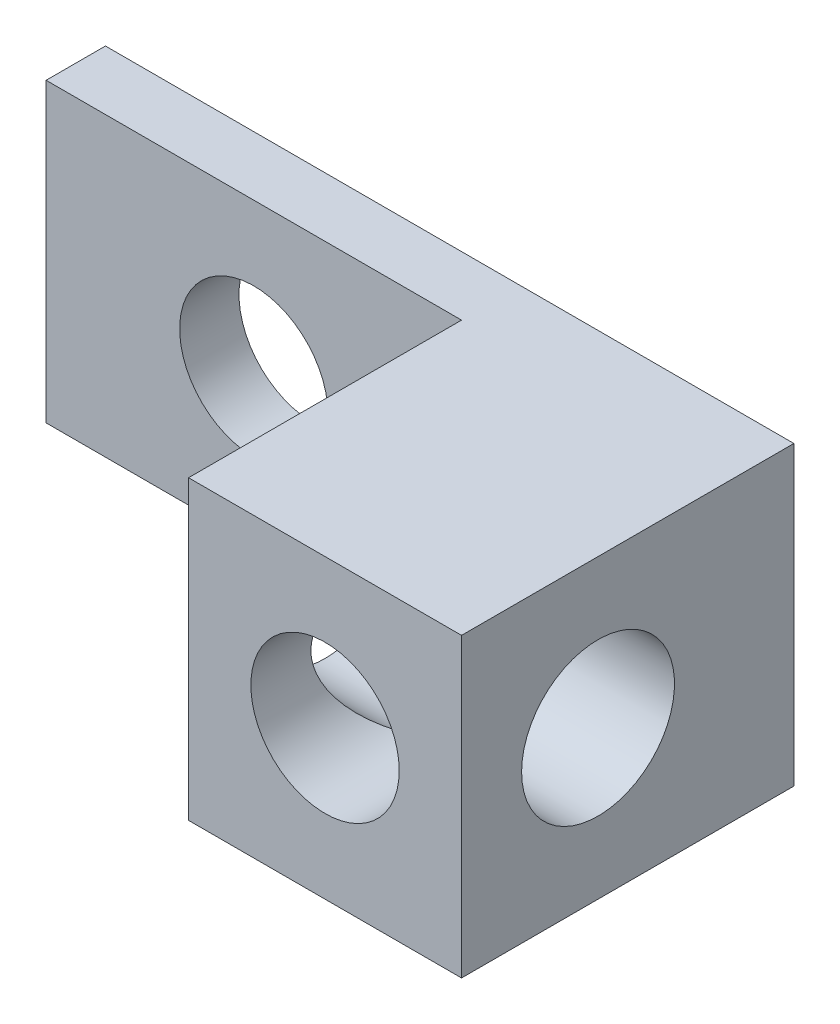
ISO-10303-21;
HEADER;
FILE_DESCRIPTION(('STEP AP214'),'2;1');
FILE_NAME('part.step','',(''),(''),'','','');
FILE_SCHEMA(('AUTOMOTIVE_DESIGN { 1 0 10303 214 1 1 1 1 }'));
ENDSEC;
DATA;
#1=APPLICATION_CONTEXT('core data for automotive mechanical design processes');
#2=APPLICATION_PROTOCOL_DEFINITION('international standard','automotive_design',2000,#1);
#3=PRODUCT_CONTEXT('',#1,'mechanical');
#4=PRODUCT('Part','Part','',(#3));
#5=PRODUCT_RELATED_PRODUCT_CATEGORY('part','',(#4));
#6=PRODUCT_DEFINITION_FORMATION('','',#4);
#7=PRODUCT_DEFINITION_CONTEXT('part definition',#1,'design');
#8=PRODUCT_DEFINITION('design','',#6,#7);
#9=PRODUCT_DEFINITION_SHAPE('','',#8);
#10=(LENGTH_UNIT() NAMED_UNIT(*) SI_UNIT(.MILLI.,.METRE.));
#11=(NAMED_UNIT(*) PLANE_ANGLE_UNIT() SI_UNIT($,.RADIAN.));
#12=(NAMED_UNIT(*) SI_UNIT($,.STERADIAN.) SOLID_ANGLE_UNIT());
#13=UNCERTAINTY_MEASURE_WITH_UNIT(LENGTH_MEASURE(1.E-05),#10,'distance_accuracy_value','');
#14=(GEOMETRIC_REPRESENTATION_CONTEXT(3) GLOBAL_UNCERTAINTY_ASSIGNED_CONTEXT((#13)) GLOBAL_UNIT_ASSIGNED_CONTEXT((#10,
#11,#12)) REPRESENTATION_CONTEXT('',''));
#15=CARTESIAN_POINT('',(0.,0.,0.));
#16=DIRECTION('',(0.,0.,1.));
#17=DIRECTION('',(1.,0.,0.));
#18=AXIS2_PLACEMENT_3D('',#15,#16,#17);
#19=CARTESIAN_POINT('',(-29.4639999999999,12.7,0.));
#20=DIRECTION('',(0.,0.,1.));
#21=DIRECTION('',(1.,0.,0.));
#22=AXIS2_PLACEMENT_3D('',#19,#20,#21);
#23=PLANE('',#22);
#24=CARTESIAN_POINT('',(-20.5740000000001,6.34999999999997,0.));
#25=DIRECTION('',(0.,0.,1.));
#26=DIRECTION('',(1.,0.,0.));
#27=AXIS2_PLACEMENT_3D('',#24,#25,#26);
#28=CIRCLE('',#27,3.175);
#29=CARTESIAN_POINT('',(-17.3990000000001,6.34999999999997,0.));
#30=VERTEX_POINT('',#29);
#31=EDGE_CURVE('E162',#30,#30,#28,.T.);
#32=ORIENTED_EDGE('',*,*,#31,.T.);
#33=EDGE_LOOP('',(#32));
#34=FACE_BOUND('',#33,.T.);
#35=DIRECTION('',(-1.,0.,0.));
#36=VECTOR('',#35,1.);
#37=CARTESIAN_POINT('',(-29.4639999999999,0.,0.));
#38=LINE('',#37,#36);
#39=CARTESIAN_POINT('',(0.,0.,0.));
#40=VERTEX_POINT('',#39);
#41=CARTESIAN_POINT('',(-29.4639999999999,0.,0.));
#42=VERTEX_POINT('',#41);
#43=EDGE_CURVE('E117',#40,#42,#38,.T.);
#44=ORIENTED_EDGE('',*,*,#43,.T.);
#45=DIRECTION('',(0.,-1.,0.));
#46=VECTOR('',#45,1.);
#47=CARTESIAN_POINT('',(-29.4639999999999,12.7,0.));
#48=LINE('',#47,#46);
#49=CARTESIAN_POINT('',(-29.4639999999999,12.7,0.));
#50=VERTEX_POINT('',#49);
#51=EDGE_CURVE('E11',#50,#42,#48,.T.);
#52=ORIENTED_EDGE('',*,*,#51,.F.);
#53=DIRECTION('',(-1.,0.,0.));
#54=VECTOR('',#53,1.);
#55=CARTESIAN_POINT('',(-29.4639999999999,12.7,0.));
#56=LINE('',#55,#54);
#57=CARTESIAN_POINT('',(0.,12.7,0.));
#58=VERTEX_POINT('',#57);
#59=EDGE_CURVE('E128',#58,#50,#56,.T.);
#60=ORIENTED_EDGE('',*,*,#59,.F.);
#61=DIRECTION('',(0.,-1.,0.));
#62=VECTOR('',#61,1.);
#63=CARTESIAN_POINT('',(0.,12.7,0.));
#64=LINE('',#63,#62);
#65=EDGE_CURVE('E113',#58,#40,#64,.T.);
#66=ORIENTED_EDGE('',*,*,#65,.T.);
#67=EDGE_LOOP('',(#44,#52,#60,#66));
#68=FACE_BOUND('',#67,.T.);
#69=ADVANCED_FACE('F33',(#34,#68),#23,.F.);
#70=CARTESIAN_POINT('',(-29.4639999999999,12.7,2.54));
#71=DIRECTION('',(1.,0.,0.));
#72=DIRECTION('',(0.,0.,-1.));
#73=AXIS2_PLACEMENT_3D('',#70,#71,#72);
#74=PLANE('',#73);
#75=DIRECTION('',(0.,0.,1.));
#76=VECTOR('',#75,1.);
#77=CARTESIAN_POINT('',(-29.4639999999999,0.,2.54));
#78=LINE('',#77,#76);
#79=CARTESIAN_POINT('',(-29.4639999999999,0.,2.54));
#80=VERTEX_POINT('',#79);
#81=EDGE_CURVE('E120',#42,#80,#78,.T.);
#82=ORIENTED_EDGE('',*,*,#81,.T.);
#83=DIRECTION('',(0.,-1.,0.));
#84=VECTOR('',#83,1.);
#85=CARTESIAN_POINT('',(-29.4639999999999,12.7,2.54));
#86=LINE('',#85,#84);
#87=CARTESIAN_POINT('',(-29.4639999999999,12.7,2.54));
#88=VERTEX_POINT('',#87);
#89=EDGE_CURVE('E41',#88,#80,#86,.T.);
#90=ORIENTED_EDGE('',*,*,#89,.F.);
#91=DIRECTION('',(0.,0.,1.));
#92=VECTOR('',#91,1.);
#93=CARTESIAN_POINT('',(-29.4639999999999,12.7,2.54));
#94=LINE('',#93,#92);
#95=EDGE_CURVE('E86',#50,#88,#94,.T.);
#96=ORIENTED_EDGE('',*,*,#95,.F.);
#97=ORIENTED_EDGE('',*,*,#51,.T.);
#98=EDGE_LOOP('',(#82,#90,#96,#97));
#99=FACE_BOUND('',#98,.T.);
#100=ADVANCED_FACE('F155',(#99),#74,.F.);
#101=CARTESIAN_POINT('',(-11.684,12.7,2.54));
#102=DIRECTION('',(0.,0.,-1.));
#103=DIRECTION('',(-1.,0.,0.));
#104=AXIS2_PLACEMENT_3D('',#101,#102,#103);
#105=PLANE('',#104);
#106=CARTESIAN_POINT('',(-20.5740000000001,6.34999999999997,2.54));
#107=DIRECTION('',(0.,0.,1.));
#108=DIRECTION('',(1.,0.,0.));
#109=AXIS2_PLACEMENT_3D('',#106,#107,#108);
#110=CIRCLE('',#109,3.175);
#111=CARTESIAN_POINT('',(-17.3990000000001,6.34999999999997,2.54));
#112=VERTEX_POINT('',#111);
#113=EDGE_CURVE('E165',#112,#112,#110,.T.);
#114=ORIENTED_EDGE('',*,*,#113,.F.);
#115=EDGE_LOOP('',(#114));
#116=FACE_BOUND('',#115,.T.);
#117=DIRECTION('',(1.,0.,0.));
#118=VECTOR('',#117,1.);
#119=CARTESIAN_POINT('',(-11.684,0.,2.54));
#120=LINE('',#119,#118);
#121=CARTESIAN_POINT('',(-11.684,0.,2.54));
#122=VERTEX_POINT('',#121);
#123=EDGE_CURVE('E123',#80,#122,#120,.T.);
#124=ORIENTED_EDGE('',*,*,#123,.T.);
#125=DIRECTION('',(0.,-1.,0.));
#126=VECTOR('',#125,1.);
#127=CARTESIAN_POINT('',(-11.684,12.7,2.54));
#128=LINE('',#127,#126);
#129=CARTESIAN_POINT('',(-11.684,12.7,2.54));
#130=VERTEX_POINT('',#129);
#131=EDGE_CURVE('E108',#130,#122,#128,.T.);
#132=ORIENTED_EDGE('',*,*,#131,.F.);
#133=DIRECTION('',(1.,0.,0.));
#134=VECTOR('',#133,1.);
#135=CARTESIAN_POINT('',(-11.684,12.7,2.54));
#136=LINE('',#135,#134);
#137=EDGE_CURVE('E99',#88,#130,#136,.T.);
#138=ORIENTED_EDGE('',*,*,#137,.F.);
#139=ORIENTED_EDGE('',*,*,#89,.T.);
#140=EDGE_LOOP('',(#124,#132,#138,#139));
#141=FACE_BOUND('',#140,.T.);
#142=ADVANCED_FACE('F134',(#116,#141),#105,.F.);
#143=CARTESIAN_POINT('',(-11.684,12.7,14.224));
#144=DIRECTION('',(1.,0.,0.));
#145=DIRECTION('',(0.,0.,-1.));
#146=AXIS2_PLACEMENT_3D('',#143,#144,#145);
#147=PLANE('',#146);
#148=CARTESIAN_POINT('',(-11.684,6.34999999999997,8.382));
#149=DIRECTION('',(-1.,0.,0.));
#150=DIRECTION('',(0.,0.,1.));
#151=AXIS2_PLACEMENT_3D('',#148,#149,#150);
#152=CIRCLE('',#151,3.27152);
#153=CARTESIAN_POINT('',(-11.684,6.34999999999997,11.65352));
#154=VERTEX_POINT('',#153);
#155=EDGE_CURVE('E204',#154,#154,#152,.T.);
#156=ORIENTED_EDGE('',*,*,#155,.F.);
#157=EDGE_LOOP('',(#156));
#158=FACE_BOUND('',#157,.T.);
#159=DIRECTION('',(0.,0.,1.));
#160=VECTOR('',#159,1.);
#161=CARTESIAN_POINT('',(-11.684,0.,14.224));
#162=LINE('',#161,#160);
#163=CARTESIAN_POINT('',(-11.684,0.,14.224));
#164=VERTEX_POINT('',#163);
#165=EDGE_CURVE('E107',#122,#164,#162,.T.);
#166=ORIENTED_EDGE('',*,*,#165,.T.);
#167=DIRECTION('',(0.,-1.,0.));
#168=VECTOR('',#167,1.);
#169=CARTESIAN_POINT('',(-11.684,12.7,14.224));
#170=LINE('',#169,#168);
#171=CARTESIAN_POINT('',(-11.684,12.7,14.224));
#172=VERTEX_POINT('',#171);
#173=EDGE_CURVE('E104',#172,#164,#170,.T.);
#174=ORIENTED_EDGE('',*,*,#173,.F.);
#175=DIRECTION('',(0.,0.,1.));
#176=VECTOR('',#175,1.);
#177=CARTESIAN_POINT('',(-11.684,12.7,14.224));
#178=LINE('',#177,#176);
#179=EDGE_CURVE('E93',#130,#172,#178,.T.);
#180=ORIENTED_EDGE('',*,*,#179,.F.);
#181=ORIENTED_EDGE('',*,*,#131,.T.);
#182=EDGE_LOOP('',(#166,#174,#180,#181));
#183=FACE_BOUND('',#182,.T.);
#184=ADVANCED_FACE('F105',(#158,#183),#147,.F.);
#185=CARTESIAN_POINT('',(0.,12.7,14.224));
#186=DIRECTION('',(0.,0.,-1.));
#187=DIRECTION('',(-1.,0.,0.));
#188=AXIS2_PLACEMENT_3D('',#185,#186,#187);
#189=PLANE('',#188);
#190=CARTESIAN_POINT('',(-5.8419999999999,6.34999999999997,14.224));
#191=DIRECTION('',(0.,0.,1.));
#192=DIRECTION('',(1.,0.,0.));
#193=AXIS2_PLACEMENT_3D('',#190,#191,#192);
#194=CIRCLE('',#193,3.175);
#195=CARTESIAN_POINT('',(-2.6669999999999,6.34999999999997,14.224));
#196=VERTEX_POINT('',#195);
#197=EDGE_CURVE('E168',#196,#196,#194,.T.);
#198=ORIENTED_EDGE('',*,*,#197,.F.);
#199=EDGE_LOOP('',(#198));
#200=FACE_BOUND('',#199,.T.);
#201=DIRECTION('',(1.,0.,0.));
#202=VECTOR('',#201,1.);
#203=CARTESIAN_POINT('',(0.,0.,14.224));
#204=LINE('',#203,#202);
#205=CARTESIAN_POINT('',(0.,0.,14.224));
#206=VERTEX_POINT('',#205);
#207=EDGE_CURVE('E72',#164,#206,#204,.T.);
#208=ORIENTED_EDGE('',*,*,#207,.T.);
#209=DIRECTION('',(0.,-1.,0.));
#210=VECTOR('',#209,1.);
#211=CARTESIAN_POINT('',(0.,12.7,14.224));
#212=LINE('',#211,#210);
#213=CARTESIAN_POINT('',(0.,12.7,14.224));
#214=VERTEX_POINT('',#213);
#215=EDGE_CURVE('E109',#214,#206,#212,.T.);
#216=ORIENTED_EDGE('',*,*,#215,.F.);
#217=DIRECTION('',(1.,0.,0.));
#218=VECTOR('',#217,1.);
#219=CARTESIAN_POINT('',(0.,12.7,14.224));
#220=LINE('',#219,#218);
#221=EDGE_CURVE('E97',#172,#214,#220,.T.);
#222=ORIENTED_EDGE('',*,*,#221,.F.);
#223=ORIENTED_EDGE('',*,*,#173,.T.);
#224=EDGE_LOOP('',(#208,#216,#222,#223));
#225=FACE_BOUND('',#224,.T.);
#226=ADVANCED_FACE('F111',(#200,#225),#189,.F.);
#227=CARTESIAN_POINT('',(0.,12.7,0.));
#228=DIRECTION('',(-1.,0.,0.));
#229=DIRECTION('',(0.,0.,1.));
#230=AXIS2_PLACEMENT_3D('',#227,#228,#229);
#231=PLANE('',#230);
#232=CARTESIAN_POINT('',(0.,6.34999999999997,8.382));
#233=DIRECTION('',(-1.,0.,0.));
#234=DIRECTION('',(0.,0.,1.));
#235=AXIS2_PLACEMENT_3D('',#232,#233,#234);
#236=CIRCLE('',#235,3.27152);
#237=CARTESIAN_POINT('',(0.,6.34999999999997,11.65352));
#238=VERTEX_POINT('',#237);
#239=EDGE_CURVE('E121',#238,#238,#236,.T.);
#240=ORIENTED_EDGE('',*,*,#239,.T.);
#241=EDGE_LOOP('',(#240));
#242=FACE_BOUND('',#241,.T.);
#243=DIRECTION('',(0.,0.,-1.));
#244=VECTOR('',#243,1.);
#245=CARTESIAN_POINT('',(0.,0.,0.));
#246=LINE('',#245,#244);
#247=EDGE_CURVE('E78',#206,#40,#246,.T.);
#248=ORIENTED_EDGE('',*,*,#247,.T.);
#249=ORIENTED_EDGE('',*,*,#65,.F.);
#250=DIRECTION('',(0.,0.,-1.));
#251=VECTOR('',#250,1.);
#252=CARTESIAN_POINT('',(0.,12.7,0.));
#253=LINE('',#252,#251);
#254=EDGE_CURVE('E49',#214,#58,#253,.T.);
#255=ORIENTED_EDGE('',*,*,#254,.F.);
#256=ORIENTED_EDGE('',*,*,#215,.T.);
#257=EDGE_LOOP('',(#248,#249,#255,#256));
#258=FACE_BOUND('',#257,.T.);
#259=ADVANCED_FACE('F141',(#242,#258),#231,.F.);
#260=CARTESIAN_POINT('',(0.,12.7,0.));
#261=DIRECTION('',(0.,-1.,0.));
#262=DIRECTION('',(0.,0.,-1.));
#263=AXIS2_PLACEMENT_3D('',#260,#261,#262);
#264=PLANE('',#263);
#265=ORIENTED_EDGE('',*,*,#59,.T.);
#266=ORIENTED_EDGE('',*,*,#95,.T.);
#267=ORIENTED_EDGE('',*,*,#137,.T.);
#268=ORIENTED_EDGE('',*,*,#179,.T.);
#269=ORIENTED_EDGE('',*,*,#221,.T.);
#270=ORIENTED_EDGE('',*,*,#254,.T.);
#271=EDGE_LOOP('',(#265,#266,#267,#268,#269,#270));
#272=FACE_BOUND('',#271,.T.);
#273=ADVANCED_FACE('F95',(#272),#264,.F.);
#274=CARTESIAN_POINT('',(0.,0.,0.));
#275=DIRECTION('',(0.,-1.,0.));
#276=DIRECTION('',(0.,0.,-1.));
#277=AXIS2_PLACEMENT_3D('',#274,#275,#276);
#278=PLANE('',#277);
#279=ORIENTED_EDGE('',*,*,#43,.F.);
#280=ORIENTED_EDGE('',*,*,#247,.F.);
#281=ORIENTED_EDGE('',*,*,#207,.F.);
#282=ORIENTED_EDGE('',*,*,#165,.F.);
#283=ORIENTED_EDGE('',*,*,#123,.F.);
#284=ORIENTED_EDGE('',*,*,#81,.F.);
#285=EDGE_LOOP('',(#279,#280,#281,#282,#283,#284));
#286=FACE_BOUND('',#285,.T.);
#287=ADVANCED_FACE('F137',(#286),#278,.T.);
#288=CARTESIAN_POINT('',(0.,6.34999999999997,8.382));
#289=DIRECTION('',(-1.,0.,0.));
#290=DIRECTION('',(0.,0.,1.));
#291=AXIS2_PLACEMENT_3D('',#288,#289,#290);
#292=CYLINDRICAL_SURFACE('',#291,3.27152);
#293=CARTESIAN_POINT('',(-2.66699999999997,6.34999999999997,11.65352));
#294=CARTESIAN_POINT('',(-2.66700041036223,6.2784570629148,11.6535195893928));
#295=CARTESIAN_POINT('',(-2.66942369227215,6.20689157401233,11.6511676524487));
#296=CARTESIAN_POINT('',(-2.67906744970302,6.06435731306767,11.6418096741903));
#297=CARTESIAN_POINT('',(-2.68629121052666,5.99338898340932,11.6348004455668));
#298=CARTESIAN_POINT('',(-2.70540910723636,5.85252394185738,11.6162564938548));
#299=CARTESIAN_POINT('',(-2.71731319816432,5.78262984631187,11.6047121245853));
#300=CARTESIAN_POINT('',(-2.74555184145464,5.64458587696845,11.5773399659719));
#301=CARTESIAN_POINT('',(-2.76188851996617,5.57643685743122,11.5615101210512));
#302=CARTESIAN_POINT('',(-2.81683500290122,5.37635742040744,11.508300783357));
#303=CARTESIAN_POINT('',(-2.86155243892648,5.24758794263363,11.46503506528));
#304=CARTESIAN_POINT('',(-2.96459512503656,5.00127664297086,11.365537905791));
#305=CARTESIAN_POINT('',(-3.02291857826348,4.88373334140052,11.3093081764628));
#306=CARTESIAN_POINT('',(-3.17679060985255,4.61504705774904,11.1613776573686));
#307=CARTESIAN_POINT('',(-3.27780516574837,4.46984062069385,11.0645780727846));
#308=CARTESIAN_POINT('',(-3.49610830709585,4.20355397914798,10.8567295586055));
#309=CARTESIAN_POINT('',(-3.61344373235946,4.08254574949501,10.7456396884132));
#310=CARTESIAN_POINT('',(-3.8205225449181,3.89913488901941,10.5517317199597));
#311=CARTESIAN_POINT('',(-3.90701698534759,3.83039492616202,10.4712992907576));
#312=CARTESIAN_POINT('',(-4.08495922898882,3.70322719496364,10.3076617368782));
#313=CARTESIAN_POINT('',(-4.17641005268968,3.64480580939107,10.2244549336165));
#314=CARTESIAN_POINT('',(-4.36377650144036,3.53804483294797,10.0569923540429));
#315=CARTESIAN_POINT('',(-4.45968520172244,3.48969020526612,9.97273834438101));
#316=CARTESIAN_POINT('',(-4.65640852452547,3.40269777975663,9.80506576616754));
#317=CARTESIAN_POINT('',(-4.75721884957936,3.36405164708468,9.72164654043798));
#318=CARTESIAN_POINT('',(-4.93004805640744,3.30793353377297,9.58701183336868));
#319=CARTESIAN_POINT('',(-5.00017992777277,3.28773272228078,9.53450418014126));
#320=CARTESIAN_POINT('',(-5.1445598848121,3.25165220506188,9.43362702546414));
#321=CARTESIAN_POINT('',(-5.21880776648447,3.23577228540909,9.38525731922723));
#322=CARTESIAN_POINT('',(-5.34946644136257,3.21296808890764,9.31092185603193));
#323=CARTESIAN_POINT('',(-5.40431490784183,3.20479228574355,9.28264759692416));
#324=CARTESIAN_POINT('',(-5.51753253204195,3.19111193529358,9.2334222810325));
#325=CARTESIAN_POINT('',(-5.57589009314387,3.18559908028843,9.21244850656801));
#326=CARTESIAN_POINT('',(-5.67995053370653,3.17883159685673,9.18616021664816));
#327=CARTESIAN_POINT('',(-5.72489920806527,3.17683498392836,9.1781665198253));
#328=CARTESIAN_POINT('',(-5.81550728512085,3.17478877196336,9.16997093979739));
#329=CARTESIAN_POINT('',(-5.86116516198651,3.17473545182807,9.16975416502779));
#330=CARTESIAN_POINT('',(-5.95165663083947,3.1765713810458,9.17711270579236));
#331=CARTESIAN_POINT('',(-5.99649193259952,3.17845598624996,9.18466939260033));
#332=CARTESIAN_POINT('',(-6.08454093475204,3.18396837718343,9.20613959209615));
#333=CARTESIAN_POINT('',(-6.12775012186056,3.18760067686586,9.22006956112449));
#334=CARTESIAN_POINT('',(-6.22214543020012,3.19740247143109,9.25629734803874));
#335=CARTESIAN_POINT('',(-6.27281617823205,3.20396786359095,9.2797928760767));
#336=CARTESIAN_POINT('',(-6.37160843016224,3.21908346953426,9.33117434420483));
#337=CARTESIAN_POINT('',(-6.41972452515079,3.22763770331212,9.35906913918599));
#338=CARTESIAN_POINT('',(-6.56160793852135,3.25610652562864,9.44710000814076));
#339=CARTESIAN_POINT('',(-6.65227635327138,3.27875470890285,9.51128654496355));
#340=CARTESIAN_POINT('',(-6.83613606818244,3.33300631925251,9.64953834397208));
#341=CARTESIAN_POINT('',(-6.9288481880955,3.36522207153892,9.72397597261677));
#342=CARTESIAN_POINT('',(-7.10995199119693,3.43753992271114,9.87444748932652));
#343=CARTESIAN_POINT('',(-7.19833965420079,3.47764919208991,9.95048277218882));
#344=CARTESIAN_POINT('',(-7.37104759168682,3.56575814476194,10.1020323772602));
#345=CARTESIAN_POINT('',(-7.45537883168557,3.61373480621609,10.1775475688074));
#346=CARTESIAN_POINT('',(-7.62020189321822,3.71786876655118,10.3269994825717));
#347=CARTESIAN_POINT('',(-7.70069547950487,3.77402225618453,10.4009369215094));
#348=CARTESIAN_POINT('',(-7.91255256819715,3.93715559419956,10.5971404998333));
#349=CARTESIAN_POINT('',(-8.04009038280577,4.0522019325806,10.7170138365736));
#350=CARTESIAN_POINT('',(-8.27974526190622,4.30826721011467,10.9439081024213));
#351=CARTESIAN_POINT('',(-8.39187920381307,4.4492573208272,11.0509430814275));
#352=CARTESIAN_POINT('',(-8.57014023895275,4.71987148191592,11.2218052604481));
#353=CARTESIAN_POINT('',(-8.64081244211281,4.84384500455802,11.2897980092628));
#354=CARTESIAN_POINT('',(-8.76674376434504,5.10599053818899,11.4112019136736));
#355=CARTESIAN_POINT('',(-8.82202300040862,5.24414369145437,11.4646320990544));
#356=CARTESIAN_POINT('',(-8.90678207503262,5.51077689333377,11.546650313923));
#357=CARTESIAN_POINT('',(-8.93887442963132,5.63764568310265,11.5777494701366));
#358=CARTESIAN_POINT('',(-8.98729731459394,5.89711101433655,11.62469603537));
#359=CARTESIAN_POINT('',(-9.00363644802508,6.02970438813637,11.6405517690349));
#360=CARTESIAN_POINT('',(-9.01939343450372,6.29720012536031,11.655842301491));
#361=CARTESIAN_POINT('',(-9.01876770041874,6.43210754631053,11.65523480198));
#362=CARTESIAN_POINT('',(-9.00053578001176,6.69966764422876,11.6375432330723));
#363=CARTESIAN_POINT('',(-8.98292648148716,6.83231990340925,11.6204561438253));
#364=CARTESIAN_POINT('',(-8.93294921514865,7.0867974783272,11.572007676129));
#365=CARTESIAN_POINT('',(-8.90114637553663,7.20884145905015,11.5411929533535));
#366=CARTESIAN_POINT('',(-8.82481892122432,7.44491271406828,11.4673420244374));
#367=CARTESIAN_POINT('',(-8.78029062568205,7.55893765694603,11.4243022822282));
#368=CARTESIAN_POINT('',(-8.66023297080823,7.82197723133152,11.3084834428503));
#369=CARTESIAN_POINT('',(-8.57945623674736,7.9664113075316,11.2307238491955));
#370=CARTESIAN_POINT('',(-8.40172775405283,8.2353514493672,11.0603939125652));
#371=CARTESIAN_POINT('',(-8.3047322522711,8.35980177515628,10.9677835353077));
#372=CARTESIAN_POINT('',(-8.0603726900438,8.63123796226739,10.735995341986));
#373=CARTESIAN_POINT('',(-7.9076474500073,8.76953608969153,10.5922623461012));
#374=CARTESIAN_POINT('',(-7.66647645573539,8.95038181364686,10.3694656382823));
#375=CARTESIAN_POINT('',(-7.58410153771495,9.00621605651979,10.2940266984659));
#376=CARTESIAN_POINT('',(-7.41546836001985,9.10945530201389,10.1417407523339));
#377=CARTESIAN_POINT('',(-7.329211755163,9.15686385475326,10.0648943541698));
#378=CARTESIAN_POINT('',(-7.15922603215763,9.24030039469759,9.91682733030199));
#379=CARTESIAN_POINT('',(-7.07577706468242,9.27690871506294,9.84560832093605));
#380=CARTESIAN_POINT('',(-6.90455233321841,9.34334226004225,9.70442840509829));
#381=CARTESIAN_POINT('',(-6.8167615123811,9.37314152396914,9.6344732203847));
#382=CARTESIAN_POINT('',(-6.6803350151215,9.41269246281479,9.53270271610961));
#383=CARTESIAN_POINT('',(-6.63377929010544,9.42507585519123,9.49911689190534));
#384=CARTESIAN_POINT('',(-6.53884753458347,9.44796959939204,9.4339571701311));
#385=CARTESIAN_POINT('',(-6.49047242891603,9.45848088767735,9.40238227176575));
#386=CARTESIAN_POINT('',(-6.39164961421519,9.47746359884503,9.34261971071678));
#387=CARTESIAN_POINT('',(-6.34121572585809,9.48594662457798,9.3144132670567));
#388=CARTESIAN_POINT('',(-6.23749930068264,9.50070471366405,9.26325357336634));
#389=CARTESIAN_POINT('',(-6.18422442025409,9.50698539701956,9.240287005227));
#390=CARTESIAN_POINT('',(-6.07978017531148,9.51647296328918,9.20456069243327));
#391=CARTESIAN_POINT('',(-6.02891313641479,9.51992009661888,9.19102330111003));
#392=CARTESIAN_POINT('',(-5.92559952071924,9.52431533136193,9.17361692992013));
#393=CARTESIAN_POINT('',(-5.87316291292012,9.52527677636789,9.16969633133914));
#394=CARTESIAN_POINT('',(-5.76850257738888,9.52458210544476,9.17248762816076));
#395=CARTESIAN_POINT('',(-5.7162795500918,9.52292035519431,9.17922241016415));
#396=CARTESIAN_POINT('',(-5.61375331576659,9.51720642174728,9.20161548163892));
#397=CARTESIAN_POINT('',(-5.56346289604493,9.51314052807488,9.21732493481463));
#398=CARTESIAN_POINT('',(-5.4625388717059,9.50267678239369,9.25600972811812));
#399=CARTESIAN_POINT('',(-5.41207407486003,9.49615098643878,9.2793722316531));
#400=CARTESIAN_POINT('',(-5.31367454891402,9.48112981740165,9.3304658390171));
#401=CARTESIAN_POINT('',(-5.26574470054231,9.47263080332913,9.35820498795557));
#402=CARTESIAN_POINT('',(-5.1245380641676,9.44437588853715,9.44567338886793));
#403=CARTESIAN_POINT('',(-5.0343340974769,9.42191807923668,9.50942528427112));
#404=CARTESIAN_POINT('',(-4.8511983035363,9.36807986492082,9.64692710260777));
#405=CARTESIAN_POINT('',(-4.75875565480546,9.3360768821758,9.72106001174402));
#406=CARTESIAN_POINT('',(-4.57817637030378,9.2642427619173,9.87094291541677));
#407=CARTESIAN_POINT('',(-4.49004367893341,9.22440461522034,9.94669430332846));
#408=CARTESIAN_POINT('',(-4.31778744880928,9.13688081369612,10.0977355053574));
#409=CARTESIAN_POINT('',(-4.23365453343956,9.08921481159577,10.1730259976955));
#410=CARTESIAN_POINT('',(-4.06919969663931,8.98575991355094,10.3220622011555));
#411=CARTESIAN_POINT('',(-3.98887605258964,8.92997473658782,10.3958086019512));
#412=CARTESIAN_POINT('',(-3.77665937090783,8.76733177584219,10.5922620072312));
#413=CARTESIAN_POINT('',(-3.64862285616816,8.6523245834352,10.7125736434642));
#414=CARTESIAN_POINT('',(-3.40801156428214,8.39623701966864,10.9403305838067));
#415=CARTESIAN_POINT('',(-3.29541757916026,8.25518956026456,11.0477918499476));
#416=CARTESIAN_POINT('',(-3.11649987467726,7.98454365390151,11.2192684219908));
#417=CARTESIAN_POINT('',(-3.04560452478345,7.86064601583729,11.2874712862285));
#418=CARTESIAN_POINT('',(-2.91918114472572,7.59853639305508,11.4093429705466));
#419=CARTESIAN_POINT('',(-2.86364035669671,7.46033642394987,11.4630238559112));
#420=CARTESIAN_POINT('',(-2.77847022604781,7.19378169835252,11.5454374295557));
#421=CARTESIAN_POINT('',(-2.74620520680259,7.06705497528535,11.5767032151471));
#422=CARTESIAN_POINT('',(-2.69746273841296,6.80800092379972,11.6239586994384));
#423=CARTESIAN_POINT('',(-2.68094255904187,6.67568977737881,11.6399897436564));
#424=CARTESIAN_POINT('',(-2.67089837579183,6.51056329860551,11.6497367863083));
#425=CARTESIAN_POINT('',(-2.66943801634127,6.47849047614224,11.6511539673394));
#426=CARTESIAN_POINT('',(-2.66748867708326,6.41427995806531,11.6530457238493));
#427=CARTESIAN_POINT('',(-2.66699981563561,6.38214225502449,11.6535201844744));
#428=CARTESIAN_POINT('',(-2.66699999999997,6.34999999999997,11.65352));
#429=B_SPLINE_CURVE_WITH_KNOTS('',3,(#293,#294,#295,#296,#297,#298,#299,#300,#301,#302,#303,
#304,#305,#306,#307,#308,#309,#310,#311,#312,#313,#314,#315,#316,#317,#318,#319,#320,#321,#322,
#323,#324,#325,#326,#327,#328,#329,#330,#331,#332,#333,#334,#335,#336,#337,#338,#339,#340,#341,
#342,#343,#344,#345,#346,#347,#348,#349,#350,#351,#352,#353,#354,#355,#356,#357,#358,#359,#360,
#361,#362,#363,#364,#365,#366,#367,#368,#369,#370,#371,#372,#373,#374,#375,#376,#377,#378,#379,
#380,#381,#382,#383,#384,#385,#386,#387,#388,#389,#390,#391,#392,#393,#394,#395,#396,#397,#398,
#399,#400,#401,#402,#403,#404,#405,#406,#407,#408,#409,#410,#411,#412,#413,#414,#415,#416,#417,
#418,#419,#420,#421,#422,#423,#424,#425,#426,#427,#428),.UNSPECIFIED.,.T.,.F.,(4,2,2,2,2,2,2,2,
2,2,2,2,2,2,2,2,2,2,2,2,2,2,2,2,2,2,2,2,2,2,2,2,2,2,2,2,2,2,2,2,2,2,2,2,2,2,2,2,2,2,2,2,2,2,2,2,
2,2,2,2,2,2,2,2,2,2,2,4),(0.,0.214588695864017,0.429324401195252,0.644519341068035,
0.859817685073121,1.28677394622379,1.71367385393585,2.3152853327736,2.91866045800189,
3.32815475264128,3.73790146799383,4.14703167849719,4.55580943677308,4.82537250308089,
5.09492222097115,5.28132808438327,5.46714859169246,5.60362986238016,5.73984977923936,
5.87574401040538,6.01199112940045,6.18029743867322,6.34894694504486,6.68833535401886,
7.05756613393104,7.42713388534281,7.79563888505276,8.16397275943817,8.79009727328218,
9.41553020023839,9.88803276966624,10.3599148982678,10.7617055741404,11.163276701682,
11.5658796668541,11.9685564221964,12.3564607796953,12.7444774524074,13.289967932289,
13.8369544446784,14.5862365485405,14.9606297841678,15.3348648953363,15.6815958933437,
16.0296275881819,16.205742802773,16.3817696723408,16.5567640883251,16.7313086418325,
16.8888104882198,17.0454650657673,17.2024565773965,17.3603521426434,17.5279502471173,
17.6958600972884,18.0332936024438,18.4011966829846,18.7694303917916,19.1367533579334,
19.5039085985413,20.1316244063771,20.7585522171256,21.2314546014501,21.7039628694977,
22.1056649487009,22.5062737100771,22.602670708875,22.6990794512171),.UNSPECIFIED.);
#430=CARTESIAN_POINT('',(-2.66699999999997,6.34999999999997,11.65352));
#431=VERTEX_POINT('',#430);
#432=EDGE_CURVE('E164',#431,#431,#429,.T.);
#433=ORIENTED_EDGE('',*,*,#432,.F.);
#434=EDGE_LOOP('',(#433));
#435=FACE_BOUND('',#434,.T.);
#436=ORIENTED_EDGE('',*,*,#239,.F.);
#437=EDGE_LOOP('',(#436));
#438=FACE_BOUND('',#437,.T.);
#439=ORIENTED_EDGE('',*,*,#155,.T.);
#440=EDGE_LOOP('',(#439));
#441=FACE_BOUND('',#440,.T.);
#442=ADVANCED_FACE('F188',(#435,#438,#441),#292,.F.);
#443=CARTESIAN_POINT('',(-5.8419999999999,6.34999999999997,-0.000999999999999265));
#444=DIRECTION('',(0.,0.,1.));
#445=DIRECTION('',(1.,0.,0.));
#446=AXIS2_PLACEMENT_3D('',#443,#444,#445);
#447=CYLINDRICAL_SURFACE('',#446,3.175);
#448=ORIENTED_EDGE('',*,*,#197,.T.);
#449=EDGE_LOOP('',(#448));
#450=FACE_BOUND('',#449,.T.);
#451=ORIENTED_EDGE('',*,*,#432,.T.);
#452=EDGE_LOOP('',(#451));
#453=FACE_BOUND('',#452,.T.);
#454=ADVANCED_FACE('F178',(#450,#453),#447,.F.);
#455=CARTESIAN_POINT('',(-20.5740000000001,6.34999999999997,0.));
#456=DIRECTION('',(0.,0.,1.));
#457=DIRECTION('',(1.,0.,0.));
#458=AXIS2_PLACEMENT_3D('',#455,#456,#457);
#459=CYLINDRICAL_SURFACE('',#458,3.175);
#460=ORIENTED_EDGE('',*,*,#31,.F.);
#461=EDGE_LOOP('',(#460));
#462=FACE_BOUND('',#461,.T.);
#463=ORIENTED_EDGE('',*,*,#113,.T.);
#464=EDGE_LOOP('',(#463));
#465=FACE_BOUND('',#464,.T.);
#466=ADVANCED_FACE('F183',(#462,#465),#459,.F.);
#467=CLOSED_SHELL('',(#69,#100,#142,#184,#226,#259,#273,#287,#442,#454,#466));
#468=MANIFOLD_SOLID_BREP('B2',#467);
#469=ADVANCED_BREP_SHAPE_REPRESENTATION('',(#18,#468),#14);
#470=SHAPE_DEFINITION_REPRESENTATION(#9,#469);
ENDSEC;
END-ISO-10303-21;
